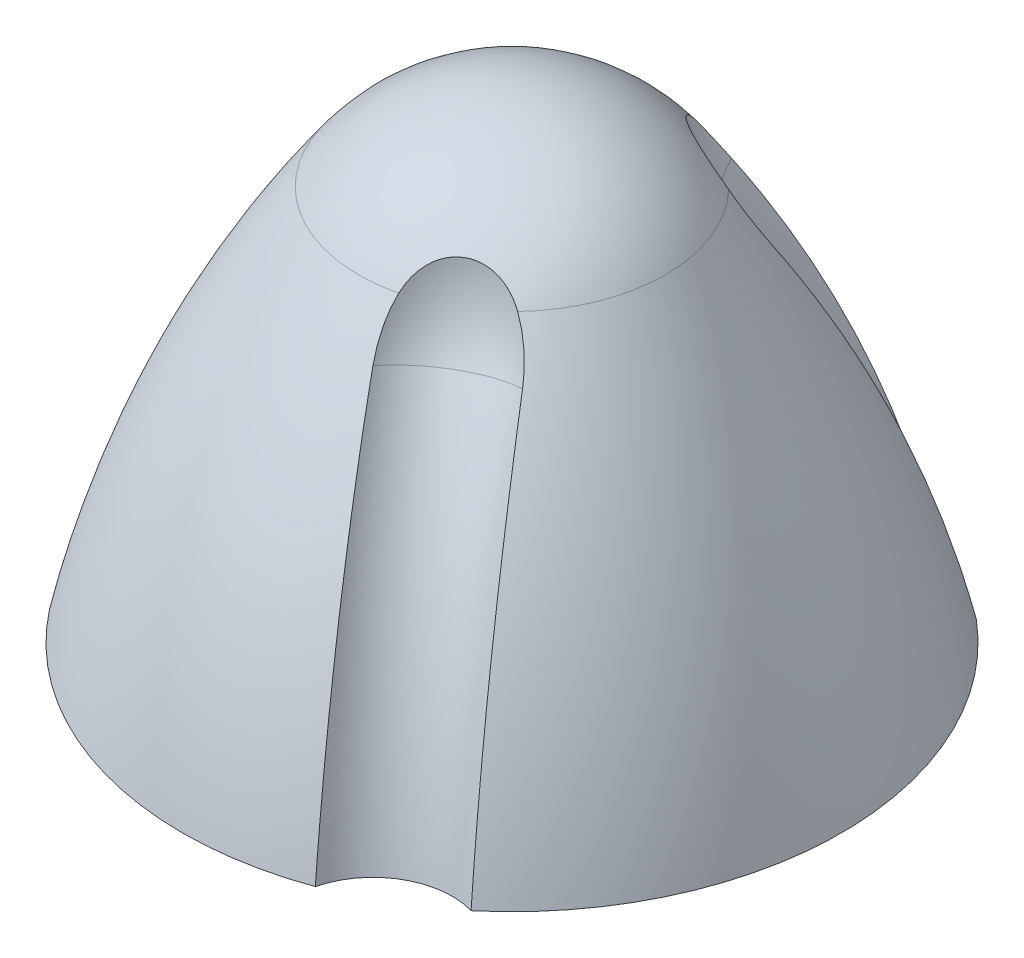
ISO-10303-21;
HEADER;
FILE_DESCRIPTION(('STEP AP214'),'2;1');
FILE_NAME('part.step','',(''),(''),'','','');
FILE_SCHEMA(('AUTOMOTIVE_DESIGN { 1 0 10303 214 1 1 1 1 }'));
ENDSEC;
DATA;
#1=APPLICATION_CONTEXT('core data for automotive mechanical design processes');
#2=APPLICATION_PROTOCOL_DEFINITION('international standard','automotive_design',2000,#1);
#3=PRODUCT_CONTEXT('',#1,'mechanical');
#4=PRODUCT('Part','Part','',(#3));
#5=PRODUCT_RELATED_PRODUCT_CATEGORY('part','',(#4));
#6=PRODUCT_DEFINITION_FORMATION('','',#4);
#7=PRODUCT_DEFINITION_CONTEXT('part definition',#1,'design');
#8=PRODUCT_DEFINITION('design','',#6,#7);
#9=PRODUCT_DEFINITION_SHAPE('','',#8);
#10=(LENGTH_UNIT() NAMED_UNIT(*) SI_UNIT(.MILLI.,.METRE.));
#11=(NAMED_UNIT(*) PLANE_ANGLE_UNIT() SI_UNIT($,.RADIAN.));
#12=(NAMED_UNIT(*) SI_UNIT($,.STERADIAN.) SOLID_ANGLE_UNIT());
#13=UNCERTAINTY_MEASURE_WITH_UNIT(LENGTH_MEASURE(1.E-05),#10,'distance_accuracy_value','');
#14=(GEOMETRIC_REPRESENTATION_CONTEXT(3) GLOBAL_UNCERTAINTY_ASSIGNED_CONTEXT((#13)) GLOBAL_UNIT_ASSIGNED_CONTEXT((#10,
#11,#12)) REPRESENTATION_CONTEXT('',''));
#15=CARTESIAN_POINT('',(0.,0.,0.));
#16=DIRECTION('',(0.,0.,1.));
#17=DIRECTION('',(1.,0.,0.));
#18=AXIS2_PLACEMENT_3D('',#15,#16,#17);
#19=CARTESIAN_POINT('',(0.,12.6390911452917,0.));
#20=DIRECTION('',(0.,-1.,0.));
#21=DIRECTION('',(0.,0.,-1.));
#22=AXIS2_PLACEMENT_3D('',#19,#20,#21);
#23=DEGENERATE_TOROIDAL_SURFACE('',#22,29.5867463295225,43.8868090245653,.F.);
#24=CARTESIAN_POINT('',(0.,38.1,0.));
#25=DIRECTION('',(0.,-1.,0.));
#26=DIRECTION('',(0.,0.,-1.));
#27=AXIS2_PLACEMENT_3D('',#24,#25,#26);
#28=CIRCLE('',#27,6.15950000000001);
#29=CARTESIAN_POINT('',(4.46799046971405,38.1,-4.23987044761327));
#30=VERTEX_POINT('',#29);
#31=CARTESIAN_POINT('',(4.467990469714,38.1,4.23987044761332));
#32=VERTEX_POINT('',#31);
#33=EDGE_CURVE('E143',#30,#32,#28,.T.);
#34=ORIENTED_EDGE('',*,*,#33,.T.);
#35=CARTESIAN_POINT('',(4.46799046971402,38.1,4.23987044761332));
#36=CARTESIAN_POINT('',(4.51602784317903,38.035455457936,4.2560263010222));
#37=CARTESIAN_POINT('',(4.56254180251641,37.9702483668957,4.27394887645332));
#38=CARTESIAN_POINT('',(4.65259612131976,37.8388683618414,4.31299717881916));
#39=CARTESIAN_POINT('',(4.69614002866465,37.7726967189857,4.33411898335811));
#40=CARTESIAN_POINT('',(4.78043373738502,37.6396042458278,4.37927091049942));
#41=CARTESIAN_POINT('',(4.82118419656331,37.5726835962499,4.40330034470053));
#42=CARTESIAN_POINT('',(4.89954110147771,37.4390709466076,4.45371771378477));
#43=CARTESIAN_POINT('',(4.93717896031144,37.3723855589826,4.48007448881014));
#44=CARTESIAN_POINT('',(5.00993075297047,37.2386048977569,4.53517424494067));
#45=CARTESIAN_POINT('',(5.04504408714413,37.1715095308532,4.5639177895054));
#46=CARTESIAN_POINT('',(5.11279473865427,37.0370584061928,4.62359871775339));
#47=CARTESIAN_POINT('',(5.14543227250465,36.9697026717485,4.65453590913881));
#48=CARTESIAN_POINT('',(5.22517549791226,36.7985833613324,4.7356194897346));
#49=CARTESIAN_POINT('',(5.27063160024965,36.6947048888091,4.7871548939555));
#50=CARTESIAN_POINT('',(5.35610763992078,36.4862322281758,4.89494238116402));
#51=CARTESIAN_POINT('',(5.39609224261758,36.3816375846017,4.95122164704667));
#52=CARTESIAN_POINT('',(5.43320163827206,36.2771712139973,5.00950093579886));
#53=B_SPLINE_CURVE_WITH_KNOTS('',3,(#35,#36,#37,#38,#39,#40,#41,#42,#43,#44,#45,#46,#47,#48,#49,
#50,#51,#52),.UNSPECIFIED.,.F.,.F.,(4,2,2,2,2,2,2,2,4),(0.,0.246124713138368,0.491950073263491,
0.737717346010771,0.980585935031306,1.22351202345563,1.46641684293718,1.83984807966585,
2.21558731192317),.UNSPECIFIED.);
#54=CARTESIAN_POINT('',(5.43320163827205,36.2771712139973,5.00950093579885));
#55=VERTEX_POINT('',#54);
#56=EDGE_CURVE('E255',#32,#55,#53,.T.);
#57=ORIENTED_EDGE('',*,*,#56,.T.);
#58=CARTESIAN_POINT('',(8.50364729913485,22.225,10.1486710465125));
#59=CARTESIAN_POINT('',(8.4464510794879,22.721725526751,10.051547926553));
#60=CARTESIAN_POINT('',(8.38477750286149,23.2164580178155,9.946861999252));
#61=CARTESIAN_POINT('',(8.25252059647867,24.2012664687796,9.72251081093988));
#62=CARTESIAN_POINT('',(8.18193806763796,24.6913428430114,9.6028468964594));
#63=CARTESIAN_POINT('',(8.03238012469846,25.6631248991435,9.34948539165769));
#64=CARTESIAN_POINT('',(7.95346157259837,26.1448641374344,9.21588294772317));
#65=CARTESIAN_POINT('',(7.78689049140073,27.1026021727258,8.93415940246133));
#66=CARTESIAN_POINT('',(7.69923716467666,27.5786004410254,8.78603697524435));
#67=CARTESIAN_POINT('',(7.51411811811811,28.5299072383755,8.47357688568506));
#68=CARTESIAN_POINT('',(7.41654665849854,29.0051379793976,8.3090649631841));
#69=CARTESIAN_POINT('',(7.21249336747633,29.9484441020246,7.96552885200534));
#70=CARTESIAN_POINT('',(7.10601063553416,30.4165187547956,7.78650319668176));
#71=CARTESIAN_POINT('',(6.88412669917567,31.3448197558388,7.41415812396091));
#72=CARTESIAN_POINT('',(6.76872525905751,31.8050458962995,7.2208383288068));
#73=CARTESIAN_POINT('',(6.52776706922537,32.7214347975841,6.81816860362479));
#74=CARTESIAN_POINT('',(6.40212177417271,33.1775133605889,6.60867997961542));
#75=CARTESIAN_POINT('',(6.14155365294813,34.0802282912494,6.17561494342323));
#76=CARTESIAN_POINT('',(6.00663101490905,34.526864850137,5.95203881692491));
#77=CARTESIAN_POINT('',(5.72719018079937,35.4099026775416,5.49106526467866));
#78=CARTESIAN_POINT('',(5.58267168003754,35.8463036204575,5.25366740008749));
#79=CARTESIAN_POINT('',(5.43320163827206,36.2771712139973,5.00950093579885));
#80=B_SPLINE_CURVE_WITH_KNOTS('',3,(#58,#59,#60,#61,#62,#63,#64,#65,#66,#67,#68,#69,#70,#71,#72,
#73,#74,#75,#76,#77,#78,#79),.UNSPECIFIED.,.F.,.F.,(4,2,2,2,2,2,2,2,2,2,4),(0.,1.52798160033633,
3.05582593268158,4.5738499191009,6.0920126529627,7.62851420287035,9.16517121376084,
10.7018688490147,12.2536468506474,13.8053933934513,15.3571892314473),.UNSPECIFIED.);
#81=CARTESIAN_POINT('',(8.50364729913485,22.225,10.1486710465125));
#82=VERTEX_POINT('',#81);
#83=EDGE_CURVE('E244',#82,#55,#80,.T.);
#84=ORIENTED_EDGE('',*,*,#83,.F.);
#85=CARTESIAN_POINT('',(0.,22.225,0.));
#86=DIRECTION('',(0.,-1.,0.));
#87=DIRECTION('',(0.,0.,-1.));
#88=AXIS2_PLACEMENT_3D('',#85,#86,#87);
#89=CIRCLE('',#88,13.2403754251307);
#90=CARTESIAN_POINT('',(8.50364729913499,22.225,-10.1486710465124));
#91=VERTEX_POINT('',#90);
#92=EDGE_CURVE('E138',#91,#82,#89,.T.);
#93=ORIENTED_EDGE('',*,*,#92,.F.);
#94=CARTESIAN_POINT('',(5.43320163827212,36.2771712139973,-5.00950093579878));
#95=CARTESIAN_POINT('',(5.58011155655471,35.8536890163349,-5.24948224819728));
#96=CARTESIAN_POINT('',(5.72223570547021,35.4248618358432,-5.48292483029525));
#97=CARTESIAN_POINT('',(5.99719687547956,34.5573419145829,-5.93644330974588));
#98=CARTESIAN_POINT('',(6.13003496141867,34.1186503126309,-6.15652073931732));
#99=CARTESIAN_POINT('',(6.38693327072811,33.2314678654048,-6.58339271747311));
#100=CARTESIAN_POINT('',(6.51098012035225,32.7829633933666,-6.79016698624877));
#101=CARTESIAN_POINT('',(6.7502068012027,31.8774597329104,-7.1898474617058));
#102=CARTESIAN_POINT('',(6.86538590704202,31.4204598533507,-7.382752533793));
#103=CARTESIAN_POINT('',(7.14349570212656,30.2633226287988,-7.849350039602));
#104=CARTESIAN_POINT('',(7.30078825960656,29.5581575321667,-8.11401394449879));
#105=CARTESIAN_POINT('',(7.59530592224825,28.1322182427586,-8.6104577366826));
#106=CARTESIAN_POINT('',(7.73252988384693,27.4114431631681,-8.84223575001991));
#107=CARTESIAN_POINT('',(7.98670214467675,25.957158681127,-9.27208744335857));
#108=CARTESIAN_POINT('',(8.10366909878916,25.2236616867982,-9.4701921303149));
#109=CARTESIAN_POINT('',(8.31733128905901,23.7455746045797,-9.83239177305484));
#110=CARTESIAN_POINT('',(8.41403292143379,23.0009880965156,-9.9964974595444));
#111=CARTESIAN_POINT('',(8.50157266444822,22.2430039053295,-10.1451480796797));
#112=CARTESIAN_POINT('',(8.50261071853026,22.2340022690604,-10.1469108068227));
#113=CARTESIAN_POINT('',(8.50364729913501,22.225,-10.1486710465124));
#114=B_SPLINE_CURVE_WITH_KNOTS('',3,(#94,#95,#96,#97,#98,#99,#100,#101,#102,#103,#104,#105,#106,
#107,#108,#109,#110,#111,#112,#113),.UNSPECIFIED.,.F.,.F.,(4,2,2,2,2,2,2,2,2,4),(0.,
1.52519984463501,3.05022450468602,4.57752142107765,6.10494313886574,8.41207995477082,
10.7193481864081,13.0244802006329,15.3288835609689,15.3565770231029),.UNSPECIFIED.);
#115=CARTESIAN_POINT('',(5.43320163827212,36.2771712139973,-5.00950093579878));
#116=VERTEX_POINT('',#115);
#117=EDGE_CURVE('E213',#116,#91,#114,.T.);
#118=ORIENTED_EDGE('',*,*,#117,.F.);
#119=CARTESIAN_POINT('',(5.43320163827212,36.2771712139973,-5.00950093579878));
#120=CARTESIAN_POINT('',(5.40227606200321,36.3642553692321,-4.96091200366701));
#121=CARTESIAN_POINT('',(5.36934554656885,36.4514186745811,-4.91372618172628));
#122=CARTESIAN_POINT('',(5.29937961728386,36.625967352258,-4.82226734720816));
#123=CARTESIAN_POINT('',(5.26233321022426,36.7133526791166,-4.77800266433743));
#124=CARTESIAN_POINT('',(5.18416902866805,36.8880214822698,-4.69271685218962));
#125=CARTESIAN_POINT('',(5.14304704326672,36.9753047569328,-4.65169915807576));
#126=CARTESIAN_POINT('',(5.05747733778261,37.1478615639432,-4.57400360496175));
#127=CARTESIAN_POINT('',(5.01310473263849,37.2331425251322,-4.53725978043667));
#128=CARTESIAN_POINT('',(4.92030601236866,37.4029789706336,-4.46766441850293));
#129=CARTESIAN_POINT('',(4.87188359990541,37.4875350413642,-4.43480939061793));
#130=CARTESIAN_POINT('',(4.77081636257592,37.6555942075949,-4.37343247312161));
#131=CARTESIAN_POINT('',(4.71817557879781,37.7390982242328,-4.34490651044547));
#132=CARTESIAN_POINT('',(4.63227093362128,37.8686852324768,-4.30404272100355));
#133=CARTESIAN_POINT('',(4.60052670493085,37.915261797354,-4.29005684641313));
#134=CARTESIAN_POINT('',(4.5354458035266,38.0080063123805,-4.26370229002682));
#135=CARTESIAN_POINT('',(4.50210402984017,38.0541723064622,-4.25133933514871));
#136=CARTESIAN_POINT('',(4.46799046971405,38.1,-4.23987044761326));
#137=B_SPLINE_CURVE_WITH_KNOTS('',3,(#119,#120,#121,#122,#123,#124,#125,#126,#127,#128,#129,
#130,#131,#132,#133,#134,#135,#136),.UNSPECIFIED.,.F.,.F.,(4,2,2,2,2,2,2,2,4),(0.,
0.313203927174998,0.627265475770521,0.941654965589247,1.25025974329506,1.55858539092357,
1.86661912292229,2.04080240056743,2.21558469295122),.UNSPECIFIED.);
#138=EDGE_CURVE('E227',#116,#30,#137,.T.);
#139=ORIENTED_EDGE('',*,*,#138,.T.);
#140=EDGE_LOOP('',(#34,#57,#84,#93,#118,#139));
#141=FACE_BOUND('',#140,.T.);
#142=ADVANCED_FACE('F30',(#141),#23,.F.);
#143=CARTESIAN_POINT('',(1.62175425154757,36.2771712139973,7.21004111052628));
#144=CARTESIAN_POINT('',(1.7561292053769,35.8536890163349,7.45725948802615));
#145=CARTESIAN_POINT('',(1.88723433734102,35.4248618358432,7.69706390252721));
#146=CARTESIAN_POINT('',(2.14251227662628,34.5573419145829,8.16194650053491));
#147=CARTESIAN_POINT('',(2.26668587846517,34.1186503126309,8.38702637233401));
#148=CARTESIAN_POINT('',(2.50791870105708,33.2314678654048,8.82294282346314));
#149=CARTESIAN_POINT('',(2.62496704585368,32.7829633933666,9.03375768088491));
#150=CARTESIAN_POINT('',(2.85148715057089,31.8774597329104,9.44077430149294));
#151=CARTESIAN_POINT('',(2.96095829059761,31.4204598533507,9.63697486917856));
#152=CARTESIAN_POINT('',(3.22598868642839,30.2633226287988,10.1111237696676));
#153=CARTESIAN_POINT('',(3.3765480727938,29.5581575321667,10.3796750727199));
#154=CARTESIAN_POINT('',(3.65922217705521,28.1322182427586,10.8829567465227));
#155=CARTESIAN_POINT('',(3.79133584384467,27.4114431631681,11.1176851899438));
#156=CARTESIAN_POINT('',(4.03651219972079,25.9571586811269,11.552730671429));
#157=CARTESIAN_POINT('',(4.14959241417752,25.2236616867982,11.7530793685718));
#158=CARTESIAN_POINT('',(4.35643541089706,23.7455746045797,12.1192160745437));
#159=CARTESIAN_POINT('',(4.45020428811516,23.0009880965156,12.2850149880125));
#160=CARTESIAN_POINT('',(4.53516962993332,22.2430039053295,12.4351519393714));
#161=CARTESIAN_POINT('',(4.53617716937811,22.2340022690604,12.4369322841484));
#162=CARTESIAN_POINT('',(4.53718329136379,22.225,12.4387101091301));
#163=B_SPLINE_CURVE_WITH_KNOTS('',3,(#143,#144,#145,#146,#147,#148,#149,#150,#151,#152,#153,
#154,#155,#156,#157,#158,#159,#160,#161,#162),.UNSPECIFIED.,.F.,.F.,(4,2,2,2,2,2,2,2,2,4),(0.,
1.52519984463501,3.050224504686,4.57752142107763,6.10494313886574,8.41207995477083,
10.7193481864081,13.0244802006329,15.3288835609689,15.3565770231029),.UNSPECIFIED.);
#164=CARTESIAN_POINT('',(1.62175425154756,36.2771712139973,7.21004111052628));
#165=VERTEX_POINT('',#164);
#166=CARTESIAN_POINT('',(4.5371832913638,22.225,12.4387101091301));
#167=VERTEX_POINT('',#166);
#168=EDGE_CURVE('E52',#165,#167,#163,.T.);
#169=ORIENTED_EDGE('',*,*,#168,.F.);
#170=CARTESIAN_POINT('',(1.62175425154756,36.2771712139973,7.21004111052629));
#171=CARTESIAN_POINT('',(1.59513779011315,36.3642553692321,7.15896430978486));
#172=CARTESIAN_POINT('',(1.5707389273312,36.4514186745811,7.10685273588863));
#173=CARTESIAN_POINT('',(1.52651621788049,36.625967352258,7.00053104646937));
#174=CARTESIAN_POINT('',(1.50670508155378,36.7133526791166,6.94631557540145));
#175=CARTESIAN_POINT('',(1.4719274924295,36.8880214822698,6.83598050243384));
#176=CARTESIAN_POINT('',(1.4569661200229,36.9753047569327,6.77985897136529));
#177=CARTESIAN_POINT('',(1.43246465000714,37.1478615639432,6.6669056560647));
#178=CARTESIAN_POINT('',(1.42282986710827,37.2331425251322,6.61010594051527));
#179=CARTESIAN_POINT('',(1.408957875823,37.4029789706336,6.49494221035604));
#180=CARTESIAN_POINT('',(1.40471579326418,37.4875350413642,6.43657965710783));
#181=CARTESIAN_POINT('',(1.40209544217113,37.6555942075949,6.31836440334202));
#182=CARTESIAN_POINT('',(1.40371162571523,37.7390982242328,6.25851316597698));
#183=CARTESIAN_POINT('',(1.4112748685519,37.8686852324768,6.16368566623006));
#184=CARTESIAN_POINT('',(1.41503486020767,37.915261797354,6.1292014204654));
#185=CARTESIAN_POINT('',(1.42475159557378,38.0080063123805,6.05966242835498));
#186=CARTESIAN_POINT('',(1.43071584942671,38.0541723064622,6.02460612789625));
#187=CARTESIAN_POINT('',(1.43784028153092,38.1,5.98932847444579));
#188=B_SPLINE_CURVE_WITH_KNOTS('',3,(#170,#171,#172,#173,#174,#175,#176,#177,#178,#179,#180,
#181,#182,#183,#184,#185,#186,#187),.UNSPECIFIED.,.F.,.F.,(4,2,2,2,2,2,2,2,4),(0.,
0.313203927175002,0.62726547577053,0.941654965589257,1.25025974329508,1.55858539092359,
1.86661912292231,2.04080240056745,2.21558469295123),.UNSPECIFIED.);
#189=CARTESIAN_POINT('',(1.43784028153093,38.1,5.98932847444578));
#190=VERTEX_POINT('',#189);
#191=EDGE_CURVE('E249',#165,#190,#188,.T.);
#192=ORIENTED_EDGE('',*,*,#191,.T.);
#193=CARTESIAN_POINT('',(-5.90583075124502,38.1,1.74945802683248));
#194=VERTEX_POINT('',#193);
#195=EDGE_CURVE('E137',#190,#194,#28,.T.);
#196=ORIENTED_EDGE('',*,*,#195,.T.);
#197=CARTESIAN_POINT('',(-5.90583075124503,38.1,1.7494580268325));
#198=CARTESIAN_POINT('',(-5.94384081744945,38.035455457936,1.78298168587984));
#199=CARTESIAN_POINT('',(-5.98261920274272,37.9702483668957,1.81430266858105));
#200=CARTESIAN_POINT('',(-6.06146318396786,37.8388683618414,1.87276784520233));
#201=CARTESIAN_POINT('',(-6.10152715694481,37.7726967189857,1.89991707287356));
#202=CARTESIAN_POINT('',(-6.1827767272392,37.6396042458278,1.95034160243395));
#203=CARTESIAN_POINT('',(-6.22396205728508,37.5726835962499,1.97361781819768));
#204=CARTESIAN_POINT('',(-6.30680323216121,37.4390709466076,2.01626820387337));
#205=CARTESIAN_POINT('',(-6.34844779831187,37.3723855589826,2.03568515825474));
#206=CARTESIAN_POINT('',(-6.43254148319275,37.238604897757,2.07114018080306));
#207=CARTESIAN_POINT('',(-6.47499079006744,37.1715095308532,2.08717744792665));
#208=CARTESIAN_POINT('',(-6.56055131580671,37.0370584061928,2.11601076913339));
#209=CARTESIAN_POINT('',(-6.60366247639342,36.9697026717485,2.12880710687199));
#210=CARTESIAN_POINT('',(-6.71375452972299,36.7985833613324,2.15732497555679));
#211=CARTESIAN_POINT('',(-6.78111355014128,36.6947048888091,2.17092341282754));
#212=CARTESIAN_POINT('',(-6.9171982721095,36.4862322281758,2.19105409099335));
#213=CARTESIAN_POINT('',(-6.98592984741861,36.3816375846017,2.19754213974768));
#214=CARTESIAN_POINT('',(-7.05495588981974,36.2771712139973,2.20054017472746));
#215=B_SPLINE_CURVE_WITH_KNOTS('',3,(#197,#198,#199,#200,#201,#202,#203,#204,#205,#206,#207,
#208,#209,#210,#211,#212,#213,#214),.UNSPECIFIED.,.F.,.F.,(4,2,2,2,2,2,2,2,4),(0.,
0.246124713138361,0.491950073263487,0.737717346010768,0.980585935031311,1.22351202345563,
1.46641684293717,1.83984807966585,2.21558731192318),.UNSPECIFIED.);
#216=CARTESIAN_POINT('',(-7.05495588981973,36.2771712139973,2.20054017472747));
#217=VERTEX_POINT('',#216);
#218=EDGE_CURVE('E206',#194,#217,#215,.T.);
#219=ORIENTED_EDGE('',*,*,#218,.T.);
#220=CARTESIAN_POINT('',(-13.0408305904989,22.225,2.29003906261757));
#221=CARTESIAN_POINT('',(-12.9281213914956,22.721725526751,2.28906724338262));
#222=CARTESIAN_POINT('',(-12.806623930721,23.2164580178155,2.28799932293242));
#223=CARTESIAN_POINT('',(-12.5462016490821,24.2012664687796,2.28563707633501));
#224=CARTESIAN_POINT('',(-12.4072783948054,24.6913428430114,2.28434277053585));
#225=CARTESIAN_POINT('',(-12.1130819238363,25.6631248991435,2.28150254501335));
#226=CARTESIAN_POINT('',(-11.9579195373312,26.1448641374344,2.27995829603206));
#227=CARTESIAN_POINT('',(-11.6306542496915,27.1026021727258,2.27656528080997));
#228=CARTESIAN_POINT('',(-11.4585498014893,27.5786004410254,2.2747164867492));
#229=CARTESIAN_POINT('',(-11.0953919029829,28.5299072383755,2.27062873448478));
#230=CARTESIAN_POINT('',(-10.9041346690619,29.0051379793976,2.26838533302038));
#231=CARTESIAN_POINT('',(-10.5045970241527,29.9484441020246,2.2634380548587));
#232=CARTESIAN_POINT('',(-10.2963148927422,30.4165187547956,2.26073413159419));
#233=CARTESIAN_POINT('',(-9.86291263261275,31.3448197558388,2.25474954237647));
#234=CARTESIAN_POINT('',(-9.6377920588958,31.8050458962995,2.2514688611779));
#235=CARTESIAN_POINT('',(-9.16859075263721,32.7214347975841,2.24412781012436));
#236=CARTESIAN_POINT('',(-8.92434563491491,33.1775133605889,2.24006010474743));
#237=CARTESIAN_POINT('',(-8.41901625146936,34.0802282912494,2.23093401044665));
#238=CARTESIAN_POINT('',(-8.15793232722255,34.526864850137,2.22587564160835));
#239=CARTESIAN_POINT('',(-7.61899710344971,35.4099026775416,2.21435955653779));
#240=CARTESIAN_POINT('',(-7.34114527152866,35.8463036204575,2.20790179585678));
#241=CARTESIAN_POINT('',(-7.05495588981973,36.2771712139973,2.20054017472746));
#242=B_SPLINE_CURVE_WITH_KNOTS('',3,(#220,#221,#222,#223,#224,#225,#226,#227,#228,#229,#230,
#231,#232,#233,#234,#235,#236,#237,#238,#239,#240,#241),.UNSPECIFIED.,.F.,.F.,(4,2,2,2,2,2,2,2,
2,2,4),(0.,1.52798160033634,3.05582593268159,4.57384991910092,6.09201265296271,7.62851420287035,
9.16517121376084,10.7018688490147,12.2536468506474,13.8053933934513,15.3571892314473),.UNSPECIFIED.);
#243=CARTESIAN_POINT('',(-13.0408305904988,22.225,2.29003906261757));
#244=VERTEX_POINT('',#243);
#245=EDGE_CURVE('E182',#244,#217,#242,.T.);
#246=ORIENTED_EDGE('',*,*,#245,.F.);
#247=EDGE_CURVE('E129',#167,#244,#89,.T.);
#248=ORIENTED_EDGE('',*,*,#247,.F.);
#249=EDGE_LOOP('',(#169,#192,#196,#219,#246,#248));
#250=FACE_BOUND('',#249,.T.);
#251=ADVANCED_FACE('F192',(#250),#23,.F.);
#252=CARTESIAN_POINT('',(0.,33.712785,0.));
#253=DIRECTION('',(0.,-1.,0.));
#254=DIRECTION('',(1.,0.,0.));
#255=AXIS2_PLACEMENT_3D('',#252,#253,#254);
#256=SPHERICAL_SURFACE('',#255,7.562215);
#257=ORIENTED_EDGE('',*,*,#195,.F.);
#258=CARTESIAN_POINT('',(1.43784028153093,38.1,5.98932847444578));
#259=CARTESIAN_POINT('',(1.45300094212645,38.1974932873846,5.91430866102576));
#260=CARTESIAN_POINT('',(1.4748708338675,38.2918489136375,5.8360531406042));
#261=CARTESIAN_POINT('',(1.53396648550888,38.4724164547869,5.67411843821124));
#262=CARTESIAN_POINT('',(1.57135253972065,38.5585314585699,5.59039056342283));
#263=CARTESIAN_POINT('',(1.66343195433147,38.7190217771266,5.41974016253303));
#264=CARTESIAN_POINT('',(1.71822369088917,38.7933266696831,5.33280202284992));
#265=CARTESIAN_POINT('',(1.8136227234402,38.8924183445099,5.20319457466644));
#266=CARTESIAN_POINT('',(1.84755623868534,38.9233462963164,5.16019699091354));
#267=CARTESIAN_POINT('',(1.91978775385682,38.9807037559537,5.07488766262122));
#268=CARTESIAN_POINT('',(1.95808418027304,39.0071348770721,5.03257567706584));
#269=CARTESIAN_POINT('',(2.0593476647491,39.067134967902,4.92808763903916));
#270=CARTESIAN_POINT('',(2.12501088641339,39.0975735980505,4.86666424814661));
#271=CARTESIAN_POINT('',(2.26480041708942,39.1457786658365,4.74861143366251));
#272=CARTESIAN_POINT('',(2.33892803009644,39.1635431478742,4.6919827510739));
#273=CARTESIAN_POINT('',(2.49394831887375,39.1855075276857,4.58536918654181));
#274=CARTESIAN_POINT('',(2.57485470724138,39.1896792145876,4.53539832818975));
#275=CARTESIAN_POINT('',(2.74084303423652,39.1841435159332,4.44388351919516));
#276=CARTESIAN_POINT('',(2.82592486079852,39.174436502674,4.40233934254051));
#277=CARTESIAN_POINT('',(2.99429098161214,39.1423010799112,4.3301260510183));
#278=CARTESIAN_POINT('',(3.07752046566293,39.1203708442297,4.29910324720806));
#279=CARTESIAN_POINT('',(3.24303065009697,39.0651969033318,4.24615654338895));
#280=CARTESIAN_POINT('',(3.32531171763428,39.0319577393093,4.22422899893445));
#281=CARTESIAN_POINT('',(3.49172871676329,38.953285192643,4.18824254086983));
#282=CARTESIAN_POINT('',(3.57569596097711,38.9072569306628,4.17471306214977));
#283=CARTESIAN_POINT('',(3.73889451178082,38.8056890677119,4.15685607394121));
#284=CARTESIAN_POINT('',(3.81811327005605,38.7501256456761,4.15255198399247));
#285=CARTESIAN_POINT('',(4.00390190151129,38.6051094519617,4.15214387279505));
#286=CARTESIAN_POINT('',(4.10725515730778,38.5114722190674,4.16045684305459));
#287=CARTESIAN_POINT('',(4.25105413299206,38.3626507043846,4.18320528421406));
#288=CARTESIAN_POINT('',(4.29703571184925,38.3117576733474,4.19247296355204));
#289=CARTESIAN_POINT('',(4.38527577647629,38.2075907944222,4.21401520315445));
#290=CARTESIAN_POINT('',(4.42754052798944,38.1543211907069,4.226284565824));
#291=CARTESIAN_POINT('',(4.46799046971403,38.1,4.23987044761333));
#292=B_SPLINE_CURVE_WITH_KNOTS('',3,(#258,#259,#260,#261,#262,#263,#264,#265,#266,#267,#268,
#269,#270,#271,#272,#273,#274,#275,#276,#277,#278,#279,#280,#281,#282,#283,#284,#285,#286,#287,
#288,#289,#290,#291),.UNSPECIFIED.,.F.,.F.,(4,2,2,2,2,2,2,2,2,2,2,2,2,2,2,2,4),(0.,
0.372038118215789,0.748019326105267,1.12616454730586,1.31460472928878,1.50297716306312,
1.78642329769608,2.06991315813822,2.35399100795354,2.6380612375058,2.911321099422,
3.1844713608339,3.47344570996022,3.76315278375351,4.17974302669361,4.38722240242083,
4.59434502681442),.UNSPECIFIED.);
#293=EDGE_CURVE('E39',#190,#32,#292,.T.);
#294=ORIENTED_EDGE('',*,*,#293,.T.);
#295=ORIENTED_EDGE('',*,*,#33,.F.);
#296=CARTESIAN_POINT('',(4.46799046971405,38.1,-4.23987044761327));
#297=CARTESIAN_POINT('',(4.39544107520739,38.1974932873846,-4.21549005811714));
#298=CARTESIAN_POINT('',(4.31673486066542,38.2918489136375,-4.19530217973212));
#299=CARTESIAN_POINT('',(4.14694746881815,38.4724164547869,-4.16551316411027));
#300=CARTESIAN_POINT('',(4.05574397514062,38.5585314585699,-4.15602649941072));
#301=CARTESIAN_POINT('',(3.86191668549864,38.7190217771266,-4.15044441118439));
#302=CARTESIAN_POINT('',(3.75923017969647,38.7933266696831,-4.15442637711927));
#303=CARTESIAN_POINT('',(3.59928732077438,38.8924183445099,-4.17224063871318));
#304=CARTESIAN_POINT('',(3.54508356332045,38.9233462963164,-4.18012913307873));
#305=CARTESIAN_POINT('',(3.43508776025378,38.9807037559537,-4.20002879602491));
#306=CARTESIAN_POINT('',(3.37929629267015,39.0071348770721,-4.21203848139782));
#307=CARTESIAN_POINT('',(3.23817525510942,39.067134967902,-4.24749121241649));
#308=CARTESIAN_POINT('',(3.15214942737775,39.0975735980505,-4.27364553502581));
#309=CARTESIAN_POINT('',(2.98001792570824,39.1457786658365,-4.3356804125323));
#310=CARTESIAN_POINT('',(2.89391224150016,39.1635431478742,-4.37156246722399));
#311=CARTESIAN_POINT('',(2.7240720418387,39.1855075276857,-4.4525071931411));
#312=CARTESIAN_POINT('',(2.64034281487309,39.1896792145876,-4.49758875161988));
#313=CARTESIAN_POINT('',(2.47809450196372,39.1841435159332,-4.59558145503205));
#314=CARTESIAN_POINT('',(2.39957527632049,39.174436502674,-4.64849238990779));
#315=CARTESIAN_POINT('',(2.25285367096455,39.1423010799112,-4.75819508190792));
#316=CARTESIAN_POINT('',(2.18437239274287,39.1203708442297,-4.81476252753466));
#317=CARTESIAN_POINT('',(2.05576410997185,39.0651969033318,-4.93162519993003));
#318=CARTESIAN_POINT('',(1.99563376566298,39.0319577393093,-4.9919189224406));
#319=CARTESIAN_POINT('',(1.88126007922229,38.953285192643,-5.11804704227557));
#320=CARTESIAN_POINT('',(1.82755958484385,38.9072569306628,-5.18400006949049));
#321=CARTESIAN_POINT('',(1.73049570401831,38.8056890677119,-5.31640566624303));
#322=CARTESIAN_POINT('',(1.6871588736449,38.7501256456761,-5.38285907839126));
#323=CARTESIAN_POINT('',(1.59391112325275,38.6051094519617,-5.54355269736714));
#324=CARTESIAN_POINT('',(1.54943373878018,38.5114722190674,-5.6372157275805));
#325=CARTESIAN_POINT('',(1.49723497887862,38.3626507043846,-5.77312351414099));
#326=CARTESIAN_POINT('',(1.48227023519085,38.3117576733474,-5.81757856920643));
#327=CARTESIAN_POINT('',(1.45680632962742,38.2075907944222,-5.90476782660622));
#328=CARTESIAN_POINT('',(1.44629953363093,38.1543211907069,-5.94750485643603));
#329=CARTESIAN_POINT('',(1.43784028153101,38.1,-5.98932847444578));
#330=B_SPLINE_CURVE_WITH_KNOTS('',3,(#296,#297,#298,#299,#300,#301,#302,#303,#304,#305,#306,
#307,#308,#309,#310,#311,#312,#313,#314,#315,#316,#317,#318,#319,#320,#321,#322,#323,#324,#325,
#326,#327,#328,#329),.UNSPECIFIED.,.F.,.F.,(4,2,2,2,2,2,2,2,2,2,2,2,2,2,2,2,4),(0.,
0.37203811821579,0.748019326105264,1.12616454730586,1.31460472928877,1.50297716306311,
1.78642329769607,2.06991315813821,2.35399100795353,2.6380612375058,2.91132109942199,
3.18447136083388,3.4734457099602,3.7631527837535,4.17974302669359,4.3872224024208,
4.59434502681439),.UNSPECIFIED.);
#331=CARTESIAN_POINT('',(1.43784028153102,38.1,-5.98932847444575));
#332=VERTEX_POINT('',#331);
#333=EDGE_CURVE('E150',#30,#332,#330,.T.);
#334=ORIENTED_EDGE('',*,*,#333,.T.);
#335=CARTESIAN_POINT('',(-5.90583075124502,38.1,-1.74945802683247));
#336=VERTEX_POINT('',#335);
#337=EDGE_CURVE('E139',#336,#332,#28,.T.);
#338=ORIENTED_EDGE('',*,*,#337,.F.);
#339=CARTESIAN_POINT('',(-5.90583075124502,38.1,-1.74945802683247));
#340=CARTESIAN_POINT('',(-5.84844201733388,38.1974932873846,-1.6988186029086));
#341=CARTESIAN_POINT('',(-5.79160569453296,38.2918489136375,-1.64075096087205));
#342=CARTESIAN_POINT('',(-5.68091395432707,38.4724164547869,-1.50860527410093));
#343=CARTESIAN_POINT('',(-5.62709651486131,38.5585314585699,-1.43436406401207));
#344=CARTESIAN_POINT('',(-5.52534863983015,38.7190217771266,-1.2692957513486));
#345=CARTESIAN_POINT('',(-5.47745387058568,38.7933266696831,-1.17837564573061));
#346=CARTESIAN_POINT('',(-5.41291004421462,38.8924183445099,-1.03095393595323));
#347=CARTESIAN_POINT('',(-5.39263980200583,38.9233462963164,-0.980067857834785));
#348=CARTESIAN_POINT('',(-5.35487551411063,38.9807037559537,-0.874858866596285));
#349=CARTESIAN_POINT('',(-5.33738047294322,39.0071348770721,-0.82053719566799));
#350=CARTESIAN_POINT('',(-5.29752291985856,39.067134967902,-0.680596426622649));
#351=CARTESIAN_POINT('',(-5.27716031379116,39.0975735980505,-0.593018713120776));
#352=CARTESIAN_POINT('',(-5.24481834279769,39.1457786658365,-0.412931021130174));
#353=CARTESIAN_POINT('',(-5.23284027159663,39.1635431478742,-0.320420283849886));
#354=CARTESIAN_POINT('',(-5.21802036071248,39.1855075276857,-0.132861993400689));
#355=CARTESIAN_POINT('',(-5.21519752211449,39.1896792145876,-0.0378095765698444));
#356=CARTESIAN_POINT('',(-5.21893753620027,39.1841435159332,0.151697935836917));
#357=CARTESIAN_POINT('',(-5.22550013711903,39.174436502674,0.246153047367317));
#358=CARTESIAN_POINT('',(-5.24714465257671,39.1423010799112,0.428069030889659));
#359=CARTESIAN_POINT('',(-5.26189285840582,39.1203708442297,0.515659280326638));
#360=CARTESIAN_POINT('',(-5.29879476006884,39.0651969033318,0.685468656541116));
#361=CARTESIAN_POINT('',(-5.32094548329728,39.0319577393093,0.767689923506183));
#362=CARTESIAN_POINT('',(-5.3729887959856,38.953285192643,0.929804501405783));
#363=CARTESIAN_POINT('',(-5.40325554582098,38.9072569306628,1.00928700734076));
#364=CARTESIAN_POINT('',(-5.46939021579914,38.8056890677119,1.15954959230185));
#365=CARTESIAN_POINT('',(-5.50527214370096,38.7501256456761,1.23030709439883));
#366=CARTESIAN_POINT('',(-5.59781302476406,38.6051094519617,1.39140882457212));
#367=CARTESIAN_POINT('',(-5.65668889608797,38.5114722190674,1.47675888452595));
#368=CARTESIAN_POINT('',(-5.74828911187069,38.3626507043846,1.58991822992698));
#369=CARTESIAN_POINT('',(-5.77930594704011,38.3117576733474,1.62510560565443));
#370=CARTESIAN_POINT('',(-5.84208210610372,38.2075907944222,1.69075262345182));
#371=CARTESIAN_POINT('',(-5.87384006162038,38.1543211907069,1.72122029061207));
#372=CARTESIAN_POINT('',(-5.90583075124505,38.1,1.7494580268325));
#373=B_SPLINE_CURVE_WITH_KNOTS('',3,(#339,#340,#341,#342,#343,#344,#345,#346,#347,#348,#349,
#350,#351,#352,#353,#354,#355,#356,#357,#358,#359,#360,#361,#362,#363,#364,#365,#366,#367,#368,
#369,#370,#371,#372),.UNSPECIFIED.,.F.,.F.,(4,2,2,2,2,2,2,2,2,2,2,2,2,2,2,2,4),(0.,
0.37203811821579,0.748019326105263,1.12616454730586,1.31460472928877,1.50297716306311,
1.78642329769607,2.06991315813821,2.35399100795353,2.6380612375058,2.911321099422,
3.18447136083389,3.47344570996021,3.76315278375351,4.1797430266936,4.38722240242082,
4.5943450268144),.UNSPECIFIED.);
#374=EDGE_CURVE('E142',#336,#194,#373,.T.);
#375=ORIENTED_EDGE('',*,*,#374,.T.);
#376=EDGE_LOOP('',(#257,#294,#295,#334,#338,#375));
#377=FACE_BOUND('',#376,.T.);
#378=ADVANCED_FACE('F32',(#377),#256,.T.);
#379=ORIENTED_EDGE('',*,*,#337,.T.);
#380=CARTESIAN_POINT('',(1.43784028153101,38.1,-5.98932847444577));
#381=CARTESIAN_POINT('',(1.42781297427041,38.035455457936,-6.03900798690199));
#382=CARTESIAN_POINT('',(1.4200774002263,37.9702483668957,-6.08825154503432));
#383=CARTESIAN_POINT('',(1.4088670626481,37.8388683618414,-6.18576502402143));
#384=CARTESIAN_POINT('',(1.40538712828016,37.7726967189857,-6.23403605623162));
#385=CARTESIAN_POINT('',(1.40234298985417,37.6396042458279,-6.32961251293332));
#386=CARTESIAN_POINT('',(1.40277786072176,37.5726835962499,-6.37691816289817));
#387=CARTESIAN_POINT('',(1.40726213068348,37.4390709466076,-6.46998591765808));
#388=CARTESIAN_POINT('',(1.41126883800042,37.3723855589826,-6.51575964706483));
#389=CARTESIAN_POINT('',(1.42261073022227,37.238604897757,-6.60631442574367));
#390=CARTESIAN_POINT('',(1.4299467029233,37.1715095308532,-6.65109523743199));
#391=CARTESIAN_POINT('',(1.44775657715242,37.0370584061928,-6.73960948688672));
#392=CARTESIAN_POINT('',(1.45823020388875,36.9697026717485,-6.78334301601074));
#393=CARTESIAN_POINT('',(1.4885790318107,36.7985833613324,-6.89294446529134));
#394=CARTESIAN_POINT('',(1.51048194989161,36.6947048888091,-6.95807830678298));
#395=CARTESIAN_POINT('',(1.56109063218872,36.4862322281758,-7.08599647215731));
#396=CARTESIAN_POINT('',(1.58983760480103,36.3816375846017,-7.14876378679429));
#397=CARTESIAN_POINT('',(1.62175425154767,36.2771712139973,-7.21004111052627));
#398=B_SPLINE_CURVE_WITH_KNOTS('',3,(#380,#381,#382,#383,#384,#385,#386,#387,#388,#389,#390,
#391,#392,#393,#394,#395,#396,#397),.UNSPECIFIED.,.F.,.F.,(4,2,2,2,2,2,2,2,4),(0.,
0.246124713138366,0.491950073263494,0.737717346010773,0.980585935031321,1.22351202345563,
1.46641684293718,1.83984807966586,2.21558731192318),.UNSPECIFIED.);
#399=CARTESIAN_POINT('',(1.62175425154767,36.2771712139973,-7.21004111052626));
#400=VERTEX_POINT('',#399);
#401=EDGE_CURVE('E232',#332,#400,#398,.T.);
#402=ORIENTED_EDGE('',*,*,#401,.T.);
#403=CARTESIAN_POINT('',(4.53718329136397,22.225,-12.43871010913));
#404=CARTESIAN_POINT('',(4.48167031200771,22.721725526751,-12.3406151699356));
#405=CARTESIAN_POINT('',(4.4218464278595,23.2164580178155,-12.2348613221843));
#406=CARTESIAN_POINT('',(4.29368105260339,24.2012664687796,-12.0081478872748));
#407=CARTESIAN_POINT('',(4.22534032716736,24.6913428430114,-11.8871896669952));
#408=CARTESIAN_POINT('',(4.08070179913779,25.6631248991435,-11.6309879366709));
#409=CARTESIAN_POINT('',(4.00445796473284,26.1448641374344,-11.4958412437551));
#410=CARTESIAN_POINT('',(3.8437637582907,27.1026021727258,-11.2107246832712));
#411=CARTESIAN_POINT('',(3.75931263681262,27.5786004410254,-11.0607534619935));
#412=CARTESIAN_POINT('',(3.58127378486479,28.5299072383755,-10.7442056201698));
#413=CARTESIAN_POINT('',(3.48758801056333,29.0051379793976,-10.5774502962044));
#414=CARTESIAN_POINT('',(3.29210365667631,29.9484441020246,-10.228966906864));
#415=CARTESIAN_POINT('',(3.19030425720802,30.4165187547956,-10.0472373282759));
#416=CARTESIAN_POINT('',(2.97878593343705,31.3448197558388,-9.66890766633732));
#417=CARTESIAN_POINT('',(2.86906679983826,31.8050458962995,-9.47230718998462));
#418=CARTESIAN_POINT('',(2.64082368341182,32.7214347975841,-9.06229641374908));
#419=CARTESIAN_POINT('',(2.52222386074219,33.1775133605889,-8.84874008436279));
#420=CARTESIAN_POINT('',(2.27746259852122,34.0802282912494,-8.40654895386982));
#421=CARTESIAN_POINT('',(2.15130131231349,34.526864850137,-8.1779144585332));
#422=CARTESIAN_POINT('',(1.89180692265033,35.4099026775416,-7.70542482121638));
#423=CARTESIAN_POINT('',(1.75847359149111,35.8463036204575,-7.4615691959442));
#424=CARTESIAN_POINT('',(1.62175425154767,36.2771712139973,-7.21004111052626));
#425=B_SPLINE_CURVE_WITH_KNOTS('',3,(#403,#404,#405,#406,#407,#408,#409,#410,#411,#412,#413,
#414,#415,#416,#417,#418,#419,#420,#421,#422,#423,#424),.UNSPECIFIED.,.F.,.F.,(4,2,2,2,2,2,2,2,
2,2,4),(0.,1.52798160033633,3.05582593268158,4.57384991910091,6.09201265296271,7.62851420287036,
9.16517121376085,10.7018688490148,12.2536468506474,13.8053933934513,15.3571892314473),.UNSPECIFIED.);
#426=CARTESIAN_POINT('',(4.53718329136396,22.225,-12.43871010913));
#427=VERTEX_POINT('',#426);
#428=EDGE_CURVE('E221',#427,#400,#425,.T.);
#429=ORIENTED_EDGE('',*,*,#428,.F.);
#430=CARTESIAN_POINT('',(-13.0408305904989,22.225,-2.29003906261757));
#431=VERTEX_POINT('',#430);
#432=EDGE_CURVE('E134',#431,#427,#89,.T.);
#433=ORIENTED_EDGE('',*,*,#432,.F.);
#434=CARTESIAN_POINT('',(-7.05495588981973,36.2771712139973,-2.20054017472747));
#435=CARTESIAN_POINT('',(-7.33624076193165,35.8536890163349,-2.20777723982883));
#436=CARTESIAN_POINT('',(-7.60947004281127,35.4248618358432,-2.21413907223191));
#437=CARTESIAN_POINT('',(-8.13970915210588,34.557341914583,-2.22550319078898));
#438=CARTESIAN_POINT('',(-8.39672083988388,34.118650312631,-2.23050563301663));
#439=CARTESIAN_POINT('',(-8.89485197178522,33.2314678654048,-2.23955010598997));
#440=CARTESIAN_POINT('',(-9.13594716620596,32.7829633933666,-2.24359069463608));
#441=CARTESIAN_POINT('',(-9.60169395177364,31.8774597329104,-2.25092683978709));
#442=CARTESIAN_POINT('',(-9.82634419763968,31.4204598533508,-2.25422233538552));
#443=CARTESIAN_POINT('',(-10.369484388555,30.2633226287988,-2.26177373006551));
#444=CARTESIAN_POINT('',(-10.6773363324004,29.5581575321667,-2.26566112822102));
#445=CARTESIAN_POINT('',(-11.2545280993035,28.1322182427586,-2.27249900984004));
#446=CARTESIAN_POINT('',(-11.5238657276917,27.4114431631681,-2.27544943992379));
#447=CARTESIAN_POINT('',(-12.0232143443976,25.9571586811269,-2.28064322807038));
#448=CARTESIAN_POINT('',(-12.2532615129667,25.2236616867982,-2.28288723825682));
#449=CARTESIAN_POINT('',(-12.6737666999562,23.7455746045797,-2.28682430148885));
#450=CARTESIAN_POINT('',(-12.8642372095491,23.0009880965156,-2.28851752846815));
#451=CARTESIAN_POINT('',(-13.0367422943816,22.2430039053295,-2.29000385969163));
#452=CARTESIAN_POINT('',(-13.0387878879084,22.2340022690604,-2.29002147732565));
#453=CARTESIAN_POINT('',(-13.0408305904988,22.225,-2.29003906261757));
#454=B_SPLINE_CURVE_WITH_KNOTS('',3,(#434,#435,#436,#437,#438,#439,#440,#441,#442,#443,#444,
#445,#446,#447,#448,#449,#450,#451,#452,#453),.UNSPECIFIED.,.F.,.F.,(4,2,2,2,2,2,2,2,2,4),(0.,
1.52519984463498,3.05022450468595,4.57752142107761,6.10494313886574,8.41207995477085,
10.7193481864081,13.0244802006329,15.3288835609689,15.3565770231029),.UNSPECIFIED.);
#455=CARTESIAN_POINT('',(-7.05495588981973,36.2771712139973,-2.20054017472747));
#456=VERTEX_POINT('',#455);
#457=EDGE_CURVE('E174',#456,#431,#454,.T.);
#458=ORIENTED_EDGE('',*,*,#457,.F.);
#459=CARTESIAN_POINT('',(-7.05495588981974,36.2771712139973,-2.20054017472747));
#460=CARTESIAN_POINT('',(-6.99741385211641,36.3642553692321,-2.1980523061178));
#461=CARTESIAN_POINT('',(-6.94008447390011,36.4514186745811,-2.1931265541623));
#462=CARTESIAN_POINT('',(-6.8258958351644,36.625967352258,-2.17826369926116));
#463=CARTESIAN_POINT('',(-6.76903829177808,36.7133526791166,-2.16831291106397));
#464=CARTESIAN_POINT('',(-6.6560965210976,36.8880214822698,-2.14326365024418));
#465=CARTESIAN_POINT('',(-6.60001316328967,36.9753047569327,-2.12815981328952));
#466=CARTESIAN_POINT('',(-6.4899419877898,37.1478615639432,-2.09290205110293));
#467=CARTESIAN_POINT('',(-6.43593459974683,37.2331425251322,-2.07284616007857));
#468=CARTESIAN_POINT('',(-6.32926388819172,37.4029789706336,-2.02727779185308));
#469=CARTESIAN_POINT('',(-6.27659939316965,37.4875350413642,-2.00177026648988));
#470=CARTESIAN_POINT('',(-6.17291180474709,37.6555942075949,-1.94493193022038));
#471=CARTESIAN_POINT('',(-6.12188720451307,37.7390982242328,-1.91360665553147));
#472=CARTESIAN_POINT('',(-6.04354580217321,37.8686852324768,-1.85964294522647));
#473=CARTESIAN_POINT('',(-6.01556156513856,37.915261797354,-1.83914457405224));
#474=CARTESIAN_POINT('',(-5.96019739910044,38.0080063123805,-1.79596013832814));
#475=CARTESIAN_POINT('',(-5.93281987926694,38.0541723064622,-1.77326679274752));
#476=CARTESIAN_POINT('',(-5.90583075124504,38.1,-1.74945802683249));
#477=B_SPLINE_CURVE_WITH_KNOTS('',3,(#459,#460,#461,#462,#463,#464,#465,#466,#467,#468,#469,
#470,#471,#472,#473,#474,#475,#476),.UNSPECIFIED.,.F.,.F.,(4,2,2,2,2,2,2,2,4),(0.,
0.313203927175002,0.627265475770524,0.941654965589238,1.25025974329505,1.55858539092356,
1.86661912292228,2.04080240056744,2.21558469295124),.UNSPECIFIED.);
#478=EDGE_CURVE('E200',#456,#336,#477,.T.);
#479=ORIENTED_EDGE('',*,*,#478,.T.);
#480=EDGE_LOOP('',(#379,#402,#429,#433,#458,#479));
#481=FACE_BOUND('',#480,.T.);
#482=ADVANCED_FACE('F187',(#481),#23,.F.);
#483=CARTESIAN_POINT('',(14.301,22.225,17.4625));
#484=DIRECTION('',(0.,-1.,0.));
#485=DIRECTION('',(0.,0.,-1.));
#486=AXIS2_PLACEMENT_3D('',#483,#484,#485);
#487=PLANE('',#486);
#488=CARTESIAN_POINT('',(0.,22.225,0.));
#489=DIRECTION('',(0.,-1.,0.));
#490=DIRECTION('',(0.,0.,-1.));
#491=AXIS2_PLACEMENT_3D('',#488,#489,#490);
#492=CIRCLE('',#491,6.35);
#493=CARTESIAN_POINT('',(0.,22.225,-6.35));
#494=VERTEX_POINT('',#493);
#495=EDGE_CURVE('E277',#494,#494,#492,.T.);
#496=ORIENTED_EDGE('',*,*,#495,.F.);
#497=EDGE_LOOP('',(#496));
#498=FACE_BOUND('',#497,.T.);
#499=CARTESIAN_POINT('',(7.61999999999988,22.225,13.1982271536749));
#500=DIRECTION('',(0.,-1.,0.));
#501=DIRECTION('',(0.866025403784443,0.,-0.499999999999992));
#502=AXIS2_PLACEMENT_3D('',#499,#500,#501);
#503=CIRCLE('',#502,3.175);
#504=EDGE_CURVE('E121',#167,#82,#503,.T.);
#505=ORIENTED_EDGE('',*,*,#504,.F.);
#506=ORIENTED_EDGE('',*,*,#247,.T.);
#507=CARTESIAN_POINT('',(-15.24,22.225,0.));
#508=DIRECTION('',(0.,-1.,0.));
#509=DIRECTION('',(0.,0.,1.));
#510=AXIS2_PLACEMENT_3D('',#507,#508,#509);
#511=CIRCLE('',#510,3.175);
#512=EDGE_CURVE('E175',#431,#244,#511,.T.);
#513=ORIENTED_EDGE('',*,*,#512,.F.);
#514=ORIENTED_EDGE('',*,*,#432,.T.);
#515=CARTESIAN_POINT('',(7.62000000000006,22.225,-13.1982271536748));
#516=DIRECTION('',(0.,-1.,0.));
#517=DIRECTION('',(-0.866025403784436,0.,-0.500000000000004));
#518=AXIS2_PLACEMENT_3D('',#515,#516,#517);
#519=CIRCLE('',#518,3.175);
#520=EDGE_CURVE('E335',#91,#427,#519,.T.);
#521=ORIENTED_EDGE('',*,*,#520,.F.);
#522=ORIENTED_EDGE('',*,*,#92,.T.);
#523=EDGE_LOOP('',(#505,#506,#513,#514,#521,#522));
#524=FACE_BOUND('',#523,.T.);
#525=ADVANCED_FACE('F162',(#498,#524),#487,.T.);
#526=CARTESIAN_POINT('',(-9.20390770345414,37.0647333017642,0.));
#527=DIRECTION('',(-0.344105628331667,-0.938930943440714,0.));
#528=DIRECTION('',(0.,0.,1.));
#529=AXIS2_PLACEMENT_3D('',#526,#527,#528);
#530=CIRCLE('',#529,3.175);
#531=CARTESIAN_POINT('',(-12.494690085342,39.7002,0.));
#532=DIRECTION('',(0.,0.,1.));
#533=AXIS1_PLACEMENT('',#531,#532);
#534=SURFACE_OF_REVOLUTION('',#530,#533);
#535=ORIENTED_EDGE('',*,*,#374,.F.);
#536=ORIENTED_EDGE('',*,*,#478,.F.);
#537=EDGE_CURVE('E169',#456,#217,#530,.T.);
#538=ORIENTED_EDGE('',*,*,#537,.T.);
#539=ORIENTED_EDGE('',*,*,#218,.F.);
#540=EDGE_LOOP('',(#535,#536,#538,#539));
#541=FACE_BOUND('',#540,.T.);
#542=ADVANCED_FACE('F155',(#541),#534,.F.);
#543=CARTESIAN_POINT('',(29.5867463295225,12.6390911452917,0.));
#544=DIRECTION('',(0.,0.,1.));
#545=AXIS1_PLACEMENT('',#543,#544);
#546=SURFACE_OF_REVOLUTION('',#530,#545);
#547=ORIENTED_EDGE('',*,*,#245,.T.);
#548=ORIENTED_EDGE('',*,*,#537,.F.);
#549=ORIENTED_EDGE('',*,*,#457,.T.);
#550=ORIENTED_EDGE('',*,*,#512,.T.);
#551=EDGE_LOOP('',(#547,#548,#549,#550));
#552=FACE_BOUND('',#551,.T.);
#553=ADVANCED_FACE('F161',(#552),#546,.T.);
#554=CARTESIAN_POINT('',(4.60195385172711,37.0647333017642,-7.97081788527856));
#555=DIRECTION('',(0.172052814165835,-0.938930943440714,-0.298004215720429));
#556=DIRECTION('',(-0.866025403784436,0.,-0.500000000000004));
#557=AXIS2_PLACEMENT_3D('',#554,#555,#556);
#558=CIRCLE('',#557,3.175);
#559=CARTESIAN_POINT('',(6.24734504267107,39.7002,-10.8207190263197));
#560=DIRECTION('',(-0.866025403784436,0.,-0.500000000000004));
#561=AXIS1_PLACEMENT('',#559,#560);
#562=SURFACE_OF_REVOLUTION('',#558,#561);
#563=ORIENTED_EDGE('',*,*,#333,.F.);
#564=ORIENTED_EDGE('',*,*,#138,.F.);
#565=EDGE_CURVE('E334',#116,#400,#558,.T.);
#566=ORIENTED_EDGE('',*,*,#565,.T.);
#567=ORIENTED_EDGE('',*,*,#401,.F.);
#568=EDGE_LOOP('',(#563,#564,#566,#567));
#569=FACE_BOUND('',#568,.T.);
#570=ADVANCED_FACE('F338',(#569),#562,.F.);
#571=CARTESIAN_POINT('',(-14.7933731647614,12.6390911452917,25.6228739366924));
#572=DIRECTION('',(-0.866025403784436,0.,-0.500000000000004));
#573=AXIS1_PLACEMENT('',#571,#572);
#574=SURFACE_OF_REVOLUTION('',#558,#573);
#575=ORIENTED_EDGE('',*,*,#428,.T.);
#576=ORIENTED_EDGE('',*,*,#565,.F.);
#577=ORIENTED_EDGE('',*,*,#117,.T.);
#578=ORIENTED_EDGE('',*,*,#520,.T.);
#579=EDGE_LOOP('',(#575,#576,#577,#578));
#580=FACE_BOUND('',#579,.T.);
#581=ADVANCED_FACE('F264',(#580),#574,.T.);
#582=CARTESIAN_POINT('',(4.601953851727,37.0647333017642,7.97081788527862));
#583=DIRECTION('',(0.172052814165831,-0.938930943440714,0.298004215720431));
#584=DIRECTION('',(0.866025403784443,0.,-0.499999999999992));
#585=AXIS2_PLACEMENT_3D('',#582,#583,#584);
#586=CIRCLE('',#585,3.175);
#587=CARTESIAN_POINT('',(6.24734504267092,39.7002,10.8207190263198));
#588=DIRECTION('',(0.866025403784443,0.,-0.499999999999992));
#589=AXIS1_PLACEMENT('',#587,#588);
#590=SURFACE_OF_REVOLUTION('',#586,#589);
#591=ORIENTED_EDGE('',*,*,#293,.F.);
#592=ORIENTED_EDGE('',*,*,#191,.F.);
#593=EDGE_CURVE('E271',#165,#55,#586,.T.);
#594=ORIENTED_EDGE('',*,*,#593,.T.);
#595=ORIENTED_EDGE('',*,*,#56,.F.);
#596=EDGE_LOOP('',(#591,#592,#594,#595));
#597=FACE_BOUND('',#596,.T.);
#598=ADVANCED_FACE('F260',(#597),#590,.F.);
#599=CARTESIAN_POINT('',(-14.793373164761,12.6390911452917,-25.6228739366926));
#600=DIRECTION('',(0.866025403784443,0.,-0.499999999999992));
#601=AXIS1_PLACEMENT('',#599,#600);
#602=SURFACE_OF_REVOLUTION('',#586,#601);
#603=ORIENTED_EDGE('',*,*,#83,.T.);
#604=ORIENTED_EDGE('',*,*,#593,.F.);
#605=ORIENTED_EDGE('',*,*,#168,.T.);
#606=ORIENTED_EDGE('',*,*,#504,.T.);
#607=EDGE_LOOP('',(#603,#604,#605,#606));
#608=FACE_BOUND('',#607,.T.);
#609=ADVANCED_FACE('F263',(#608),#602,.T.);
#610=CARTESIAN_POINT('',(0.,25.4,0.));
#611=DIRECTION('',(0.,-1.,0.));
#612=DIRECTION('',(0.,0.,-1.));
#613=AXIS2_PLACEMENT_3D('',#610,#611,#612);
#614=PLANE('',#613);
#615=CARTESIAN_POINT('',(0.,25.4,0.));
#616=DIRECTION('',(0.,-1.,0.));
#617=DIRECTION('',(0.,0.,-1.));
#618=AXIS2_PLACEMENT_3D('',#615,#616,#617);
#619=CIRCLE('',#618,6.35);
#620=CARTESIAN_POINT('',(0.,25.4,-6.35));
#621=VERTEX_POINT('',#620);
#622=EDGE_CURVE('E122',#621,#621,#619,.T.);
#623=ORIENTED_EDGE('',*,*,#622,.T.);
#624=EDGE_LOOP('',(#623));
#625=FACE_BOUND('',#624,.T.);
#626=CARTESIAN_POINT('',(0.,25.4,0.));
#627=DIRECTION('',(0.,-1.,0.));
#628=DIRECTION('',(0.,0.,-1.));
#629=AXIS2_PLACEMENT_3D('',#626,#627,#628);
#630=CIRCLE('',#629,3.);
#631=CARTESIAN_POINT('',(-2.43482920140202,25.4,-1.7526));
#632=VERTEX_POINT('',#631);
#633=CARTESIAN_POINT('',(2.43482920140202,25.4,-1.7526));
#634=VERTEX_POINT('',#633);
#635=EDGE_CURVE('E44',#632,#634,#630,.F.);
#636=ORIENTED_EDGE('',*,*,#635,.T.);
#637=DIRECTION('',(-1.,0.,0.));
#638=VECTOR('',#637,1.);
#639=CARTESIAN_POINT('',(-2.43482920140202,25.4,-1.7526));
#640=LINE('',#639,#638);
#641=EDGE_CURVE('E11',#634,#632,#640,.T.);
#642=ORIENTED_EDGE('',*,*,#641,.T.);
#643=EDGE_LOOP('',(#636,#642));
#644=FACE_BOUND('',#643,.T.);
#645=ADVANCED_FACE('F111',(#625,#644),#614,.T.);
#646=CARTESIAN_POINT('',(0.,25.4,0.));
#647=DIRECTION('',(0.,-1.,0.));
#648=DIRECTION('',(0.,0.,-1.));
#649=AXIS2_PLACEMENT_3D('',#646,#647,#648);
#650=CYLINDRICAL_SURFACE('',#649,6.35);
#651=ORIENTED_EDGE('',*,*,#622,.F.);
#652=EDGE_LOOP('',(#651));
#653=FACE_BOUND('',#652,.T.);
#654=ORIENTED_EDGE('',*,*,#495,.T.);
#655=EDGE_LOOP('',(#654));
#656=FACE_BOUND('',#655,.T.);
#657=ADVANCED_FACE('F284',(#653,#656),#650,.F.);
#658=CARTESIAN_POINT('',(0.,31.75,0.));
#659=DIRECTION('',(0.,1.,0.));
#660=DIRECTION('',(0.,0.,1.));
#661=AXIS2_PLACEMENT_3D('',#658,#659,#660);
#662=PLANE('',#661);
#663=CARTESIAN_POINT('',(0.,31.75,0.));
#664=DIRECTION('',(0.,-1.,0.));
#665=DIRECTION('',(0.,0.,1.));
#666=AXIS2_PLACEMENT_3D('',#663,#664,#665);
#667=CIRCLE('',#666,3.);
#668=CARTESIAN_POINT('',(2.43482920140202,31.75,-1.7526));
#669=VERTEX_POINT('',#668);
#670=CARTESIAN_POINT('',(-2.43482920140202,31.75,-1.7526));
#671=VERTEX_POINT('',#670);
#672=EDGE_CURVE('E131',#669,#671,#667,.T.);
#673=ORIENTED_EDGE('',*,*,#672,.T.);
#674=DIRECTION('',(1.,0.,0.));
#675=VECTOR('',#674,1.);
#676=CARTESIAN_POINT('',(-2.43482920140202,31.75,-1.7526));
#677=LINE('',#676,#675);
#678=EDGE_CURVE('E127',#671,#669,#677,.T.);
#679=ORIENTED_EDGE('',*,*,#678,.T.);
#680=EDGE_LOOP('',(#673,#679));
#681=FACE_BOUND('',#680,.T.);
#682=ADVANCED_FACE('F165',(#681),#662,.F.);
#683=CARTESIAN_POINT('',(-2.43482920140202,31.75,-1.7526));
#684=DIRECTION('',(0.,0.,-1.));
#685=DIRECTION('',(-1.,0.,0.));
#686=AXIS2_PLACEMENT_3D('',#683,#684,#685);
#687=PLANE('',#686);
#688=ORIENTED_EDGE('',*,*,#641,.F.);
#689=DIRECTION('',(0.,-1.,0.));
#690=VECTOR('',#689,1.);
#691=CARTESIAN_POINT('',(2.43482920140202,31.75,-1.7526));
#692=LINE('',#691,#690);
#693=EDGE_CURVE('E120',#669,#634,#692,.T.);
#694=ORIENTED_EDGE('',*,*,#693,.F.);
#695=ORIENTED_EDGE('',*,*,#678,.F.);
#696=DIRECTION('',(0.,-1.,0.));
#697=VECTOR('',#696,1.);
#698=CARTESIAN_POINT('',(-2.43482920140202,31.75,-1.7526));
#699=LINE('',#698,#697);
#700=EDGE_CURVE('E118',#671,#632,#699,.T.);
#701=ORIENTED_EDGE('',*,*,#700,.T.);
#702=EDGE_LOOP('',(#688,#694,#695,#701));
#703=FACE_BOUND('',#702,.T.);
#704=ADVANCED_FACE('F125',(#703),#687,.F.);
#705=CARTESIAN_POINT('',(0.,31.75,0.));
#706=DIRECTION('',(0.,-1.,0.));
#707=DIRECTION('',(0.,0.,-1.));
#708=AXIS2_PLACEMENT_3D('',#705,#706,#707);
#709=CYLINDRICAL_SURFACE('',#708,3.);
#710=ORIENTED_EDGE('',*,*,#635,.F.);
#711=ORIENTED_EDGE('',*,*,#700,.F.);
#712=ORIENTED_EDGE('',*,*,#672,.F.);
#713=ORIENTED_EDGE('',*,*,#693,.T.);
#714=EDGE_LOOP('',(#710,#711,#712,#713));
#715=FACE_BOUND('',#714,.T.);
#716=ADVANCED_FACE('F116',(#715),#709,.F.);
#717=CLOSED_SHELL('',(#142,#251,#378,#482,#525,#542,#553,#570,#581,#598,#609,#645,#657,#682,
#704,#716));
#718=MANIFOLD_SOLID_BREP('B2',#717);
#719=ADVANCED_BREP_SHAPE_REPRESENTATION('',(#18,#718),#14);
#720=SHAPE_DEFINITION_REPRESENTATION(#9,#719);
ENDSEC;
END-ISO-10303-21;
